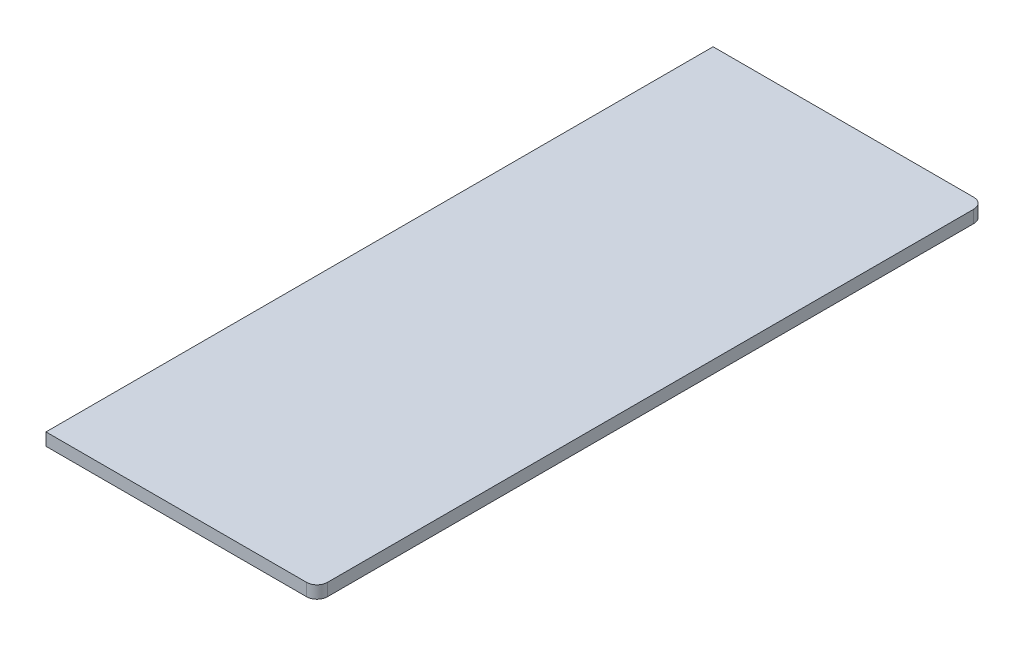
ISO-10303-21;
HEADER;
FILE_DESCRIPTION(('STEP AP214'),'2;1');
FILE_NAME('part.step','',(''),(''),'','','');
FILE_SCHEMA(('AUTOMOTIVE_DESIGN { 1 0 10303 214 1 1 1 1 }'));
ENDSEC;
DATA;
#1=APPLICATION_CONTEXT('core data for automotive mechanical design processes');
#2=APPLICATION_PROTOCOL_DEFINITION('international standard','automotive_design',2000,#1);
#3=PRODUCT_CONTEXT('',#1,'mechanical');
#4=PRODUCT('Part','Part','',(#3));
#5=PRODUCT_RELATED_PRODUCT_CATEGORY('part','',(#4));
#6=PRODUCT_DEFINITION_FORMATION('','',#4);
#7=PRODUCT_DEFINITION_CONTEXT('part definition',#1,'design');
#8=PRODUCT_DEFINITION('design','',#6,#7);
#9=PRODUCT_DEFINITION_SHAPE('','',#8);
#10=(LENGTH_UNIT() NAMED_UNIT(*) SI_UNIT(.MILLI.,.METRE.));
#11=(NAMED_UNIT(*) PLANE_ANGLE_UNIT() SI_UNIT($,.RADIAN.));
#12=(NAMED_UNIT(*) SI_UNIT($,.STERADIAN.) SOLID_ANGLE_UNIT());
#13=UNCERTAINTY_MEASURE_WITH_UNIT(LENGTH_MEASURE(1.E-05),#10,'distance_accuracy_value','');
#14=(GEOMETRIC_REPRESENTATION_CONTEXT(3) GLOBAL_UNCERTAINTY_ASSIGNED_CONTEXT((#13)) GLOBAL_UNIT_ASSIGNED_CONTEXT((#10,
#11,#12)) REPRESENTATION_CONTEXT('',''));
#15=CARTESIAN_POINT('',(0.,0.,0.));
#16=DIRECTION('',(0.,0.,1.));
#17=DIRECTION('',(1.,0.,0.));
#18=AXIS2_PLACEMENT_3D('',#15,#16,#17);
#19=CARTESIAN_POINT('',(130.,6.,0.));
#20=DIRECTION('',(0.,0.,1.));
#21=DIRECTION('',(1.,0.,0.));
#22=AXIS2_PLACEMENT_3D('',#19,#20,#21);
#23=PLANE('',#22);
#24=DIRECTION('',(-1.,0.,0.));
#25=VECTOR('',#24,1.);
#26=CARTESIAN_POINT('',(130.,6.,0.));
#27=LINE('',#26,#25);
#28=CARTESIAN_POINT('',(125.,6.,0.));
#29=VERTEX_POINT('',#28);
#30=CARTESIAN_POINT('',(0.,6.,0.));
#31=VERTEX_POINT('',#30);
#32=EDGE_CURVE('E92',#29,#31,#27,.T.);
#33=ORIENTED_EDGE('',*,*,#32,.F.);
#34=DIRECTION('',(0.,-1.,0.));
#35=VECTOR('',#34,1.);
#36=CARTESIAN_POINT('',(125.,6.,0.));
#37=LINE('',#36,#35);
#38=CARTESIAN_POINT('',(125.,0.,0.));
#39=VERTEX_POINT('',#38);
#40=EDGE_CURVE('E119',#29,#39,#37,.T.);
#41=ORIENTED_EDGE('',*,*,#40,.T.);
#42=DIRECTION('',(-1.,0.,0.));
#43=VECTOR('',#42,1.);
#44=CARTESIAN_POINT('',(130.,0.,0.));
#45=LINE('',#44,#43);
#46=CARTESIAN_POINT('',(0.,0.,0.));
#47=VERTEX_POINT('',#46);
#48=EDGE_CURVE('E117',#39,#47,#45,.T.);
#49=ORIENTED_EDGE('',*,*,#48,.T.);
#50=DIRECTION('',(0.,-1.,0.));
#51=VECTOR('',#50,1.);
#52=CARTESIAN_POINT('',(0.,6.,0.));
#53=LINE('',#52,#51);
#54=EDGE_CURVE('E109',#31,#47,#53,.T.);
#55=ORIENTED_EDGE('',*,*,#54,.F.);
#56=EDGE_LOOP('',(#33,#41,#49,#55));
#57=FACE_BOUND('',#56,.T.);
#58=ADVANCED_FACE('F41',(#57),#23,.F.);
#59=CARTESIAN_POINT('',(0.,6.,0.));
#60=DIRECTION('',(1.,0.,0.));
#61=DIRECTION('',(0.,0.,-1.));
#62=AXIS2_PLACEMENT_3D('',#59,#60,#61);
#63=PLANE('',#62);
#64=DIRECTION('',(0.,0.,1.));
#65=VECTOR('',#64,1.);
#66=CARTESIAN_POINT('',(0.,0.,0.));
#67=LINE('',#66,#65);
#68=CARTESIAN_POINT('',(0.,0.,320.));
#69=VERTEX_POINT('',#68);
#70=EDGE_CURVE('E144',#47,#69,#67,.T.);
#71=ORIENTED_EDGE('',*,*,#70,.T.);
#72=DIRECTION('',(0.,-1.,0.));
#73=VECTOR('',#72,1.);
#74=CARTESIAN_POINT('',(0.,6.,320.));
#75=LINE('',#74,#73);
#76=CARTESIAN_POINT('',(0.,6.,320.));
#77=VERTEX_POINT('',#76);
#78=EDGE_CURVE('E115',#77,#69,#75,.T.);
#79=ORIENTED_EDGE('',*,*,#78,.F.);
#80=DIRECTION('',(0.,0.,1.));
#81=VECTOR('',#80,1.);
#82=CARTESIAN_POINT('',(0.,6.,0.));
#83=LINE('',#82,#81);
#84=EDGE_CURVE('E98',#31,#77,#83,.T.);
#85=ORIENTED_EDGE('',*,*,#84,.F.);
#86=ORIENTED_EDGE('',*,*,#54,.T.);
#87=EDGE_LOOP('',(#71,#79,#85,#86));
#88=FACE_BOUND('',#87,.T.);
#89=ADVANCED_FACE('F108',(#88),#63,.F.);
#90=CARTESIAN_POINT('',(0.,6.,320.));
#91=DIRECTION('',(0.,0.,-1.));
#92=DIRECTION('',(-1.,0.,0.));
#93=AXIS2_PLACEMENT_3D('',#90,#91,#92);
#94=PLANE('',#93);
#95=DIRECTION('',(1.,0.,0.));
#96=VECTOR('',#95,1.);
#97=CARTESIAN_POINT('',(0.,0.,320.));
#98=LINE('',#97,#96);
#99=CARTESIAN_POINT('',(125.,0.,320.));
#100=VERTEX_POINT('',#99);
#101=EDGE_CURVE('E141',#69,#100,#98,.T.);
#102=ORIENTED_EDGE('',*,*,#101,.T.);
#103=DIRECTION('',(0.,-1.,0.));
#104=VECTOR('',#103,1.);
#105=CARTESIAN_POINT('',(125.,6.,320.));
#106=LINE('',#105,#104);
#107=CARTESIAN_POINT('',(125.,6.,320.));
#108=VERTEX_POINT('',#107);
#109=EDGE_CURVE('E11',#100,#108,#106,.F.);
#110=ORIENTED_EDGE('',*,*,#109,.T.);
#111=DIRECTION('',(1.,0.,0.));
#112=VECTOR('',#111,1.);
#113=CARTESIAN_POINT('',(0.,6.,320.));
#114=LINE('',#113,#112);
#115=EDGE_CURVE('E114',#77,#108,#114,.T.);
#116=ORIENTED_EDGE('',*,*,#115,.F.);
#117=ORIENTED_EDGE('',*,*,#78,.T.);
#118=EDGE_LOOP('',(#102,#110,#116,#117));
#119=FACE_BOUND('',#118,.T.);
#120=ADVANCED_FACE('F145',(#119),#94,.F.);
#121=CARTESIAN_POINT('',(130.,6.,320.));
#122=DIRECTION('',(-1.,0.,0.));
#123=DIRECTION('',(0.,0.,1.));
#124=AXIS2_PLACEMENT_3D('',#121,#122,#123);
#125=PLANE('',#124);
#126=DIRECTION('',(0.,0.,-1.));
#127=VECTOR('',#126,1.);
#128=CARTESIAN_POINT('',(130.,0.,320.));
#129=LINE('',#128,#127);
#130=CARTESIAN_POINT('',(130.,0.,315.));
#131=VERTEX_POINT('',#130);
#132=CARTESIAN_POINT('',(130.,0.,5.));
#133=VERTEX_POINT('',#132);
#134=EDGE_CURVE('E104',#131,#133,#129,.T.);
#135=ORIENTED_EDGE('',*,*,#134,.T.);
#136=DIRECTION('',(0.,-1.,0.));
#137=VECTOR('',#136,1.);
#138=CARTESIAN_POINT('',(130.,6.,5.));
#139=LINE('',#138,#137);
#140=CARTESIAN_POINT('',(130.,6.,5.));
#141=VERTEX_POINT('',#140);
#142=EDGE_CURVE('E65',#133,#141,#139,.F.);
#143=ORIENTED_EDGE('',*,*,#142,.T.);
#144=DIRECTION('',(0.,0.,-1.));
#145=VECTOR('',#144,1.);
#146=CARTESIAN_POINT('',(130.,6.,320.));
#147=LINE('',#146,#145);
#148=CARTESIAN_POINT('',(130.,6.,315.));
#149=VERTEX_POINT('',#148);
#150=EDGE_CURVE('E124',#149,#141,#147,.T.);
#151=ORIENTED_EDGE('',*,*,#150,.F.);
#152=DIRECTION('',(0.,-1.,0.));
#153=VECTOR('',#152,1.);
#154=CARTESIAN_POINT('',(130.,6.,315.));
#155=LINE('',#154,#153);
#156=EDGE_CURVE('E129',#149,#131,#155,.T.);
#157=ORIENTED_EDGE('',*,*,#156,.T.);
#158=EDGE_LOOP('',(#135,#143,#151,#157));
#159=FACE_BOUND('',#158,.T.);
#160=ADVANCED_FACE('F139',(#159),#125,.F.);
#161=CARTESIAN_POINT('',(0.,6.,0.));
#162=DIRECTION('',(0.,1.,0.));
#163=DIRECTION('',(0.,0.,1.));
#164=AXIS2_PLACEMENT_3D('',#161,#162,#163);
#165=PLANE('',#164);
#166=ORIENTED_EDGE('',*,*,#150,.T.);
#167=CARTESIAN_POINT('',(125.,6.,5.));
#168=DIRECTION('',(0.,1.,0.));
#169=DIRECTION('',(0.,0.,1.));
#170=AXIS2_PLACEMENT_3D('',#167,#168,#169);
#171=CIRCLE('',#170,5.);
#172=EDGE_CURVE('E47',#141,#29,#171,.T.);
#173=ORIENTED_EDGE('',*,*,#172,.T.);
#174=ORIENTED_EDGE('',*,*,#32,.T.);
#175=ORIENTED_EDGE('',*,*,#84,.T.);
#176=ORIENTED_EDGE('',*,*,#115,.T.);
#177=CARTESIAN_POINT('',(125.,6.,315.));
#178=DIRECTION('',(0.,1.,0.));
#179=DIRECTION('',(0.,0.,1.));
#180=AXIS2_PLACEMENT_3D('',#177,#178,#179);
#181=CIRCLE('',#180,5.);
#182=EDGE_CURVE('E134',#108,#149,#181,.T.);
#183=ORIENTED_EDGE('',*,*,#182,.T.);
#184=EDGE_LOOP('',(#166,#173,#174,#175,#176,#183));
#185=FACE_BOUND('',#184,.T.);
#186=ADVANCED_FACE('F100',(#185),#165,.T.);
#187=CARTESIAN_POINT('',(0.,0.,0.));
#188=DIRECTION('',(0.,1.,0.));
#189=DIRECTION('',(0.,0.,1.));
#190=AXIS2_PLACEMENT_3D('',#187,#188,#189);
#191=PLANE('',#190);
#192=ORIENTED_EDGE('',*,*,#48,.F.);
#193=CARTESIAN_POINT('',(125.,0.,5.));
#194=DIRECTION('',(0.,1.,0.));
#195=DIRECTION('',(0.,0.,1.));
#196=AXIS2_PLACEMENT_3D('',#193,#194,#195);
#197=CIRCLE('',#196,5.);
#198=EDGE_CURVE('E130',#39,#133,#197,.F.);
#199=ORIENTED_EDGE('',*,*,#198,.T.);
#200=ORIENTED_EDGE('',*,*,#134,.F.);
#201=CARTESIAN_POINT('',(125.,0.,315.));
#202=DIRECTION('',(0.,1.,0.));
#203=DIRECTION('',(0.,0.,1.));
#204=AXIS2_PLACEMENT_3D('',#201,#202,#203);
#205=CIRCLE('',#204,5.);
#206=EDGE_CURVE('E118',#131,#100,#205,.F.);
#207=ORIENTED_EDGE('',*,*,#206,.T.);
#208=ORIENTED_EDGE('',*,*,#101,.F.);
#209=ORIENTED_EDGE('',*,*,#70,.F.);
#210=EDGE_LOOP('',(#192,#199,#200,#207,#208,#209));
#211=FACE_BOUND('',#210,.T.);
#212=ADVANCED_FACE('F142',(#211),#191,.F.);
#213=CARTESIAN_POINT('',(125.,6.,5.));
#214=DIRECTION('',(0.,-1.,0.));
#215=DIRECTION('',(0.,0.,-1.));
#216=AXIS2_PLACEMENT_3D('',#213,#214,#215);
#217=CYLINDRICAL_SURFACE('',#216,5.);
#218=ORIENTED_EDGE('',*,*,#172,.F.);
#219=ORIENTED_EDGE('',*,*,#142,.F.);
#220=ORIENTED_EDGE('',*,*,#198,.F.);
#221=ORIENTED_EDGE('',*,*,#40,.F.);
#222=EDGE_LOOP('',(#218,#219,#220,#221));
#223=FACE_BOUND('',#222,.T.);
#224=ADVANCED_FACE('F151',(#223),#217,.T.);
#225=CARTESIAN_POINT('',(125.,6.,315.));
#226=DIRECTION('',(0.,-1.,0.));
#227=DIRECTION('',(0.,0.,-1.));
#228=AXIS2_PLACEMENT_3D('',#225,#226,#227);
#229=CYLINDRICAL_SURFACE('',#228,5.);
#230=ORIENTED_EDGE('',*,*,#182,.F.);
#231=ORIENTED_EDGE('',*,*,#109,.F.);
#232=ORIENTED_EDGE('',*,*,#206,.F.);
#233=ORIENTED_EDGE('',*,*,#156,.F.);
#234=EDGE_LOOP('',(#230,#231,#232,#233));
#235=FACE_BOUND('',#234,.T.);
#236=ADVANCED_FACE('F43',(#235),#229,.T.);
#237=CLOSED_SHELL('',(#58,#89,#120,#160,#186,#212,#224,#236));
#238=MANIFOLD_SOLID_BREP('B2',#237);
#239=ADVANCED_BREP_SHAPE_REPRESENTATION('',(#18,#238),#14);
#240=SHAPE_DEFINITION_REPRESENTATION(#9,#239);
ENDSEC;
END-ISO-10303-21;
